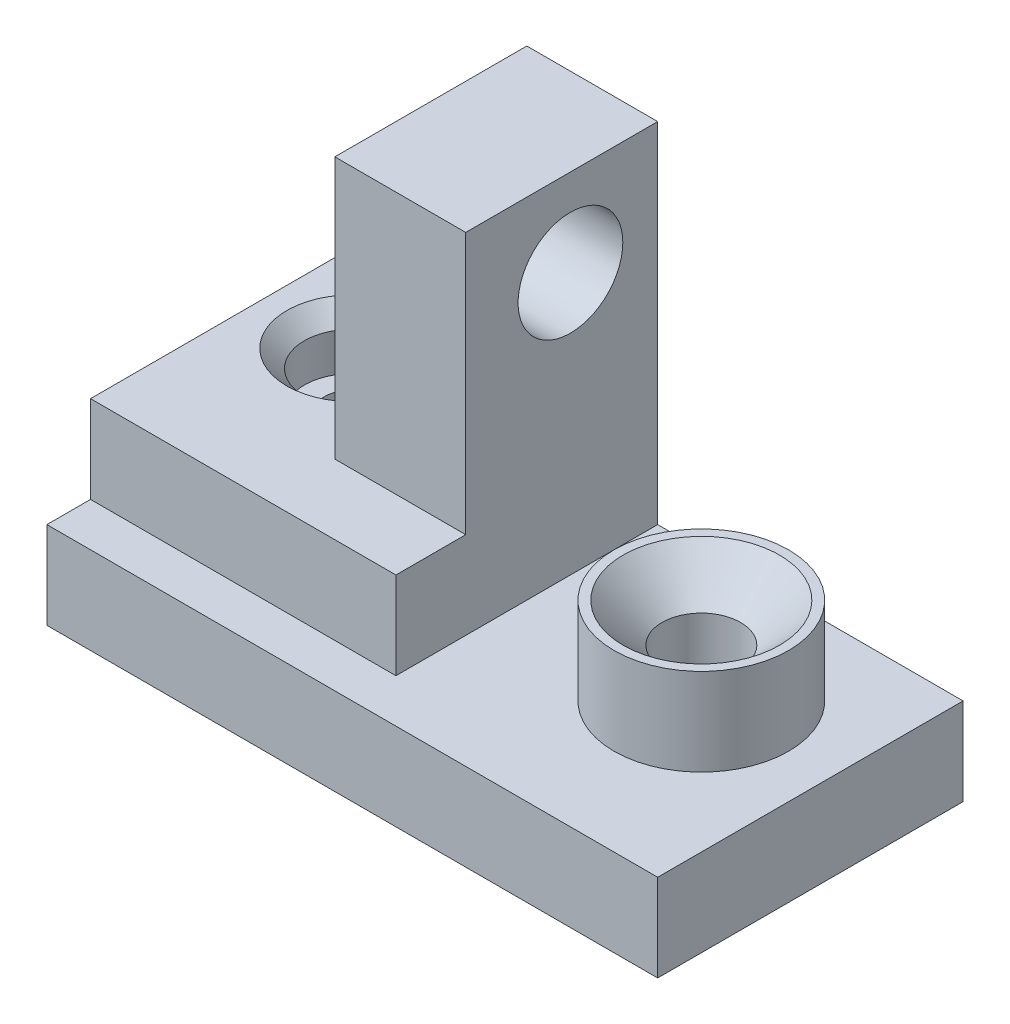
ISO-10303-21;
HEADER;
FILE_DESCRIPTION(('STEP AP214'),'2;1');
FILE_NAME('part.step','',(''),(''),'','','');
FILE_SCHEMA(('AUTOMOTIVE_DESIGN { 1 0 10303 214 1 1 1 1 }'));
ENDSEC;
DATA;
#1=APPLICATION_CONTEXT('core data for automotive mechanical design processes');
#2=APPLICATION_PROTOCOL_DEFINITION('international standard','automotive_design',2000,#1);
#3=PRODUCT_CONTEXT('',#1,'mechanical');
#4=PRODUCT('Part','Part','',(#3));
#5=PRODUCT_RELATED_PRODUCT_CATEGORY('part','',(#4));
#6=PRODUCT_DEFINITION_FORMATION('','',#4);
#7=PRODUCT_DEFINITION_CONTEXT('part definition',#1,'design');
#8=PRODUCT_DEFINITION('design','',#6,#7);
#9=PRODUCT_DEFINITION_SHAPE('','',#8);
#10=(LENGTH_UNIT() NAMED_UNIT(*) SI_UNIT(.MILLI.,.METRE.));
#11=(NAMED_UNIT(*) PLANE_ANGLE_UNIT() SI_UNIT($,.RADIAN.));
#12=(NAMED_UNIT(*) SI_UNIT($,.STERADIAN.) SOLID_ANGLE_UNIT());
#13=UNCERTAINTY_MEASURE_WITH_UNIT(LENGTH_MEASURE(1.E-05),#10,'distance_accuracy_value','');
#14=(GEOMETRIC_REPRESENTATION_CONTEXT(3) GLOBAL_UNCERTAINTY_ASSIGNED_CONTEXT((#13)) GLOBAL_UNIT_ASSIGNED_CONTEXT((#10,
#11,#12)) REPRESENTATION_CONTEXT('',''));
#15=CARTESIAN_POINT('',(0.,0.,0.));
#16=DIRECTION('',(0.,0.,1.));
#17=DIRECTION('',(1.,0.,0.));
#18=AXIS2_PLACEMENT_3D('',#15,#16,#17);
#19=CARTESIAN_POINT('',(0.,10.,-35.));
#20=DIRECTION('',(0.,0.,-1.));
#21=DIRECTION('',(-1.,0.,0.));
#22=AXIS2_PLACEMENT_3D('',#19,#20,#21);
#23=PLANE('',#22);
#24=DIRECTION('',(1.,0.,0.));
#25=VECTOR('',#24,1.);
#26=CARTESIAN_POINT('',(0.,0.,-35.));
#27=LINE('',#26,#25);
#28=CARTESIAN_POINT('',(0.,0.,-35.));
#29=VERTEX_POINT('',#28);
#30=CARTESIAN_POINT('',(70.,0.,-35.));
#31=VERTEX_POINT('',#30);
#32=EDGE_CURVE('E115',#29,#31,#27,.T.);
#33=ORIENTED_EDGE('',*,*,#32,.F.);
#34=DIRECTION('',(0.,-1.,0.));
#35=VECTOR('',#34,1.);
#36=CARTESIAN_POINT('',(0.,20.,-35.));
#37=LINE('',#36,#35);
#38=CARTESIAN_POINT('',(0.,20.,-35.));
#39=VERTEX_POINT('',#38);
#40=EDGE_CURVE('E117',#39,#29,#37,.T.);
#41=ORIENTED_EDGE('',*,*,#40,.F.);
#42=DIRECTION('',(1.,0.,0.));
#43=VECTOR('',#42,1.);
#44=CARTESIAN_POINT('',(0.,20.,-35.));
#45=LINE('',#44,#43);
#46=CARTESIAN_POINT('',(20.,20.,-35.));
#47=VERTEX_POINT('',#46);
#48=EDGE_CURVE('E162',#39,#47,#45,.T.);
#49=ORIENTED_EDGE('',*,*,#48,.T.);
#50=DIRECTION('',(0.,-1.,0.));
#51=VECTOR('',#50,1.);
#52=CARTESIAN_POINT('',(20.,50.,-35.));
#53=LINE('',#52,#51);
#54=CARTESIAN_POINT('',(20.,50.,-35.));
#55=VERTEX_POINT('',#54);
#56=EDGE_CURVE('E180',#55,#47,#53,.T.);
#57=ORIENTED_EDGE('',*,*,#56,.F.);
#58=DIRECTION('',(1.,0.,0.));
#59=VECTOR('',#58,1.);
#60=CARTESIAN_POINT('',(0.,50.,-35.));
#61=LINE('',#60,#59);
#62=CARTESIAN_POINT('',(35.,50.,-35.));
#63=VERTEX_POINT('',#62);
#64=EDGE_CURVE('E183',#55,#63,#61,.T.);
#65=ORIENTED_EDGE('',*,*,#64,.T.);
#66=DIRECTION('',(0.,-1.,0.));
#67=VECTOR('',#66,1.);
#68=CARTESIAN_POINT('',(35.,50.,-35.));
#69=LINE('',#68,#67);
#70=CARTESIAN_POINT('',(35.,10.,-35.));
#71=VERTEX_POINT('',#70);
#72=EDGE_CURVE('E178',#63,#71,#69,.T.);
#73=ORIENTED_EDGE('',*,*,#72,.T.);
#74=DIRECTION('',(1.,0.,0.));
#75=VECTOR('',#74,1.);
#76=CARTESIAN_POINT('',(0.,10.,-35.));
#77=LINE('',#76,#75);
#78=CARTESIAN_POINT('',(70.,10.,-35.));
#79=VERTEX_POINT('',#78);
#80=EDGE_CURVE('E78',#71,#79,#77,.T.);
#81=ORIENTED_EDGE('',*,*,#80,.T.);
#82=DIRECTION('',(0.,-1.,0.));
#83=VECTOR('',#82,1.);
#84=CARTESIAN_POINT('',(70.,10.,-35.));
#85=LINE('',#84,#83);
#86=EDGE_CURVE('E74',#79,#31,#85,.T.);
#87=ORIENTED_EDGE('',*,*,#86,.T.);
#88=EDGE_LOOP('',(#33,#41,#49,#57,#65,#73,#81,#87));
#89=FACE_BOUND('',#88,.T.);
#90=ADVANCED_FACE('F37',(#89),#23,.T.);
#91=CARTESIAN_POINT('',(0.,10.,0.));
#92=DIRECTION('',(-1.,0.,0.));
#93=DIRECTION('',(0.,0.,1.));
#94=AXIS2_PLACEMENT_3D('',#91,#92,#93);
#95=PLANE('',#94);
#96=DIRECTION('',(0.,0.,-1.));
#97=VECTOR('',#96,1.);
#98=CARTESIAN_POINT('',(0.,0.,0.));
#99=LINE('',#98,#97);
#100=CARTESIAN_POINT('',(0.,0.,0.));
#101=VERTEX_POINT('',#100);
#102=EDGE_CURVE('E99',#101,#29,#99,.T.);
#103=ORIENTED_EDGE('',*,*,#102,.F.);
#104=DIRECTION('',(0.,-1.,0.));
#105=VECTOR('',#104,1.);
#106=CARTESIAN_POINT('',(0.,10.,0.));
#107=LINE('',#106,#105);
#108=CARTESIAN_POINT('',(0.,10.,0.));
#109=VERTEX_POINT('',#108);
#110=EDGE_CURVE('E11',#109,#101,#107,.T.);
#111=ORIENTED_EDGE('',*,*,#110,.F.);
#112=DIRECTION('',(0.,0.,-1.));
#113=VECTOR('',#112,1.);
#114=CARTESIAN_POINT('',(0.,10.,0.));
#115=LINE('',#114,#113);
#116=CARTESIAN_POINT('',(0.,10.,-5.));
#117=VERTEX_POINT('',#116);
#118=EDGE_CURVE('E95',#109,#117,#115,.T.);
#119=ORIENTED_EDGE('',*,*,#118,.T.);
#120=DIRECTION('',(0.,-1.,0.));
#121=VECTOR('',#120,1.);
#122=CARTESIAN_POINT('',(0.,20.,-5.));
#123=LINE('',#122,#121);
#124=CARTESIAN_POINT('',(0.,20.,-5.));
#125=VERTEX_POINT('',#124);
#126=EDGE_CURVE('E135',#125,#117,#123,.T.);
#127=ORIENTED_EDGE('',*,*,#126,.F.);
#128=DIRECTION('',(0.,0.,-1.));
#129=VECTOR('',#128,1.);
#130=CARTESIAN_POINT('',(0.,20.,0.));
#131=LINE('',#130,#129);
#132=EDGE_CURVE('E132',#125,#39,#131,.T.);
#133=ORIENTED_EDGE('',*,*,#132,.T.);
#134=ORIENTED_EDGE('',*,*,#40,.T.);
#135=EDGE_LOOP('',(#103,#111,#119,#127,#133,#134));
#136=FACE_BOUND('',#135,.T.);
#137=ADVANCED_FACE('F92',(#136),#95,.T.);
#138=CARTESIAN_POINT('',(0.,10.,0.));
#139=DIRECTION('',(0.,0.,-1.));
#140=DIRECTION('',(-1.,0.,0.));
#141=AXIS2_PLACEMENT_3D('',#138,#139,#140);
#142=PLANE('',#141);
#143=DIRECTION('',(1.,0.,0.));
#144=VECTOR('',#143,1.);
#145=CARTESIAN_POINT('',(0.,0.,0.));
#146=LINE('',#145,#144);
#147=CARTESIAN_POINT('',(70.,0.,0.));
#148=VERTEX_POINT('',#147);
#149=EDGE_CURVE('E119',#101,#148,#146,.T.);
#150=ORIENTED_EDGE('',*,*,#149,.T.);
#151=DIRECTION('',(0.,-1.,0.));
#152=VECTOR('',#151,1.);
#153=CARTESIAN_POINT('',(70.,10.,0.));
#154=LINE('',#153,#152);
#155=CARTESIAN_POINT('',(70.,10.,0.));
#156=VERTEX_POINT('',#155);
#157=EDGE_CURVE('E45',#156,#148,#154,.T.);
#158=ORIENTED_EDGE('',*,*,#157,.F.);
#159=DIRECTION('',(1.,0.,0.));
#160=VECTOR('',#159,1.);
#161=CARTESIAN_POINT('',(0.,10.,0.));
#162=LINE('',#161,#160);
#163=EDGE_CURVE('E103',#109,#156,#162,.T.);
#164=ORIENTED_EDGE('',*,*,#163,.F.);
#165=ORIENTED_EDGE('',*,*,#110,.T.);
#166=EDGE_LOOP('',(#150,#158,#164,#165));
#167=FACE_BOUND('',#166,.T.);
#168=ADVANCED_FACE('F104',(#167),#142,.F.);
#169=CARTESIAN_POINT('',(70.,10.,0.));
#170=DIRECTION('',(-1.,0.,0.));
#171=DIRECTION('',(0.,0.,1.));
#172=AXIS2_PLACEMENT_3D('',#169,#170,#171);
#173=PLANE('',#172);
#174=DIRECTION('',(0.,0.,-1.));
#175=VECTOR('',#174,1.);
#176=CARTESIAN_POINT('',(70.,0.,0.));
#177=LINE('',#176,#175);
#178=EDGE_CURVE('E67',#148,#31,#177,.T.);
#179=ORIENTED_EDGE('',*,*,#178,.T.);
#180=ORIENTED_EDGE('',*,*,#86,.F.);
#181=DIRECTION('',(0.,0.,-1.));
#182=VECTOR('',#181,1.);
#183=CARTESIAN_POINT('',(70.,10.,0.));
#184=LINE('',#183,#182);
#185=EDGE_CURVE('E53',#156,#79,#184,.T.);
#186=ORIENTED_EDGE('',*,*,#185,.F.);
#187=ORIENTED_EDGE('',*,*,#157,.T.);
#188=EDGE_LOOP('',(#179,#180,#186,#187));
#189=FACE_BOUND('',#188,.T.);
#190=ADVANCED_FACE('F124',(#189),#173,.F.);
#191=CARTESIAN_POINT('',(0.,10.,0.));
#192=DIRECTION('',(0.,1.,0.));
#193=DIRECTION('',(0.,0.,1.));
#194=AXIS2_PLACEMENT_3D('',#191,#192,#193);
#195=PLANE('',#194);
#196=CARTESIAN_POINT('',(55.,10.,-20.));
#197=DIRECTION('',(0.,1.,0.));
#198=DIRECTION('',(0.,0.,1.));
#199=AXIS2_PLACEMENT_3D('',#196,#197,#198);
#200=CIRCLE('',#199,9.99999999999999);
#201=CARTESIAN_POINT('',(55.,10.,-10.));
#202=VERTEX_POINT('',#201);
#203=EDGE_CURVE('E122',#202,#202,#200,.T.);
#204=ORIENTED_EDGE('',*,*,#203,.F.);
#205=EDGE_LOOP('',(#204));
#206=FACE_BOUND('',#205,.T.);
#207=ORIENTED_EDGE('',*,*,#80,.F.);
#208=DIRECTION('',(0.,0.,1.));
#209=VECTOR('',#208,1.);
#210=CARTESIAN_POINT('',(35.,10.,0.));
#211=LINE('',#210,#209);
#212=CARTESIAN_POINT('',(35.,10.,-5.));
#213=VERTEX_POINT('',#212);
#214=EDGE_CURVE('E110',#71,#213,#211,.T.);
#215=ORIENTED_EDGE('',*,*,#214,.T.);
#216=DIRECTION('',(1.,0.,0.));
#217=VECTOR('',#216,1.);
#218=CARTESIAN_POINT('',(0.,10.,-5.));
#219=LINE('',#218,#217);
#220=EDGE_CURVE('E108',#117,#213,#219,.T.);
#221=ORIENTED_EDGE('',*,*,#220,.F.);
#222=ORIENTED_EDGE('',*,*,#118,.F.);
#223=ORIENTED_EDGE('',*,*,#163,.T.);
#224=ORIENTED_EDGE('',*,*,#185,.T.);
#225=EDGE_LOOP('',(#207,#215,#221,#222,#223,#224));
#226=FACE_BOUND('',#225,.T.);
#227=ADVANCED_FACE('F106',(#206,#226),#195,.T.);
#228=CARTESIAN_POINT('',(0.,0.,0.));
#229=DIRECTION('',(0.,1.,0.));
#230=DIRECTION('',(0.,0.,1.));
#231=AXIS2_PLACEMENT_3D('',#228,#229,#230);
#232=PLANE('',#231);
#233=CARTESIAN_POINT('',(55.,0.,-20.));
#234=DIRECTION('',(0.,1.,0.));
#235=DIRECTION('',(0.,0.,1.));
#236=AXIS2_PLACEMENT_3D('',#233,#234,#235);
#237=CIRCLE('',#236,4.5);
#238=CARTESIAN_POINT('',(55.,0.,-15.5));
#239=VERTEX_POINT('',#238);
#240=EDGE_CURVE('E195',#239,#239,#237,.T.);
#241=ORIENTED_EDGE('',*,*,#240,.T.);
#242=EDGE_LOOP('',(#241));
#243=FACE_BOUND('',#242,.T.);
#244=ORIENTED_EDGE('',*,*,#102,.T.);
#245=ORIENTED_EDGE('',*,*,#32,.T.);
#246=ORIENTED_EDGE('',*,*,#178,.F.);
#247=ORIENTED_EDGE('',*,*,#149,.F.);
#248=EDGE_LOOP('',(#244,#245,#246,#247));
#249=FACE_BOUND('',#248,.T.);
#250=ADVANCED_FACE('F125',(#243,#249),#232,.F.);
#251=CARTESIAN_POINT('',(0.,20.,-5.));
#252=DIRECTION('',(0.,0.,-1.));
#253=DIRECTION('',(-1.,0.,0.));
#254=AXIS2_PLACEMENT_3D('',#251,#252,#253);
#255=PLANE('',#254);
#256=ORIENTED_EDGE('',*,*,#220,.T.);
#257=DIRECTION('',(0.,-1.,0.));
#258=VECTOR('',#257,1.);
#259=CARTESIAN_POINT('',(35.,20.,-5.));
#260=LINE('',#259,#258);
#261=CARTESIAN_POINT('',(35.,20.,-5.));
#262=VERTEX_POINT('',#261);
#263=EDGE_CURVE('E137',#262,#213,#260,.T.);
#264=ORIENTED_EDGE('',*,*,#263,.F.);
#265=DIRECTION('',(1.,0.,0.));
#266=VECTOR('',#265,1.);
#267=CARTESIAN_POINT('',(0.,20.,-5.));
#268=LINE('',#267,#266);
#269=EDGE_CURVE('E156',#125,#262,#268,.T.);
#270=ORIENTED_EDGE('',*,*,#269,.F.);
#271=ORIENTED_EDGE('',*,*,#126,.T.);
#272=EDGE_LOOP('',(#256,#264,#270,#271));
#273=FACE_BOUND('',#272,.T.);
#274=ADVANCED_FACE('F149',(#273),#255,.F.);
#275=CARTESIAN_POINT('',(35.,20.,0.));
#276=DIRECTION('',(1.,0.,0.));
#277=DIRECTION('',(0.,0.,-1.));
#278=AXIS2_PLACEMENT_3D('',#275,#276,#277);
#279=PLANE('',#278);
#280=CARTESIAN_POINT('',(35.,40.,-25.));
#281=DIRECTION('',(1.,0.,0.));
#282=DIRECTION('',(0.,0.,-1.));
#283=AXIS2_PLACEMENT_3D('',#280,#281,#282);
#284=CIRCLE('',#283,6.);
#285=CARTESIAN_POINT('',(35.,40.,-31.));
#286=VERTEX_POINT('',#285);
#287=EDGE_CURVE('E222',#286,#286,#284,.T.);
#288=ORIENTED_EDGE('',*,*,#287,.F.);
#289=EDGE_LOOP('',(#288));
#290=FACE_BOUND('',#289,.T.);
#291=ORIENTED_EDGE('',*,*,#263,.T.);
#292=ORIENTED_EDGE('',*,*,#214,.F.);
#293=ORIENTED_EDGE('',*,*,#72,.F.);
#294=DIRECTION('',(0.,0.,1.));
#295=VECTOR('',#294,1.);
#296=CARTESIAN_POINT('',(35.,50.,0.));
#297=LINE('',#296,#295);
#298=CARTESIAN_POINT('',(35.,50.,-13.));
#299=VERTEX_POINT('',#298);
#300=EDGE_CURVE('E186',#63,#299,#297,.T.);
#301=ORIENTED_EDGE('',*,*,#300,.T.);
#302=DIRECTION('',(0.,-1.,0.));
#303=VECTOR('',#302,1.);
#304=CARTESIAN_POINT('',(35.,50.,-13.));
#305=LINE('',#304,#303);
#306=CARTESIAN_POINT('',(35.,20.,-13.));
#307=VERTEX_POINT('',#306);
#308=EDGE_CURVE('E176',#299,#307,#305,.T.);
#309=ORIENTED_EDGE('',*,*,#308,.T.);
#310=DIRECTION('',(0.,0.,1.));
#311=VECTOR('',#310,1.);
#312=CARTESIAN_POINT('',(35.,20.,0.));
#313=LINE('',#312,#311);
#314=EDGE_CURVE('E155',#307,#262,#313,.T.);
#315=ORIENTED_EDGE('',*,*,#314,.T.);
#316=EDGE_LOOP('',(#291,#292,#293,#301,#309,#315));
#317=FACE_BOUND('',#316,.T.);
#318=ADVANCED_FACE('F152',(#290,#317),#279,.T.);
#319=CARTESIAN_POINT('',(0.,20.,0.));
#320=DIRECTION('',(0.,1.,0.));
#321=DIRECTION('',(0.,0.,1.));
#322=AXIS2_PLACEMENT_3D('',#319,#320,#321);
#323=PLANE('',#322);
#324=CARTESIAN_POINT('',(10.,20.,-25.));
#325=DIRECTION('',(0.,1.,0.));
#326=DIRECTION('',(0.,0.,1.));
#327=AXIS2_PLACEMENT_3D('',#324,#325,#326);
#328=CIRCLE('',#327,7.5);
#329=CARTESIAN_POINT('',(10.,20.,-17.5));
#330=VERTEX_POINT('',#329);
#331=EDGE_CURVE('E216',#330,#330,#328,.T.);
#332=ORIENTED_EDGE('',*,*,#331,.F.);
#333=EDGE_LOOP('',(#332));
#334=FACE_BOUND('',#333,.T.);
#335=DIRECTION('',(1.,0.,0.));
#336=VECTOR('',#335,1.);
#337=CARTESIAN_POINT('',(0.,20.,-13.));
#338=LINE('',#337,#336);
#339=CARTESIAN_POINT('',(20.,20.,-13.));
#340=VERTEX_POINT('',#339);
#341=EDGE_CURVE('E167',#340,#307,#338,.T.);
#342=ORIENTED_EDGE('',*,*,#341,.F.);
#343=DIRECTION('',(0.,0.,1.));
#344=VECTOR('',#343,1.);
#345=CARTESIAN_POINT('',(20.,20.,0.));
#346=LINE('',#345,#344);
#347=EDGE_CURVE('E164',#47,#340,#346,.T.);
#348=ORIENTED_EDGE('',*,*,#347,.F.);
#349=ORIENTED_EDGE('',*,*,#48,.F.);
#350=ORIENTED_EDGE('',*,*,#132,.F.);
#351=ORIENTED_EDGE('',*,*,#269,.T.);
#352=ORIENTED_EDGE('',*,*,#314,.F.);
#353=EDGE_LOOP('',(#342,#348,#349,#350,#351,#352));
#354=FACE_BOUND('',#353,.T.);
#355=ADVANCED_FACE('F229',(#334,#354),#323,.T.);
#356=CARTESIAN_POINT('',(55.,20.,-20.));
#357=DIRECTION('',(0.,-1.,0.));
#358=DIRECTION('',(0.,0.,-1.));
#359=AXIS2_PLACEMENT_3D('',#356,#357,#358);
#360=CYLINDRICAL_SURFACE('',#359,9.99999999999999);
#361=ORIENTED_EDGE('',*,*,#203,.T.);
#362=EDGE_LOOP('',(#361));
#363=FACE_BOUND('',#362,.T.);
#364=CARTESIAN_POINT('',(55.,20.,-20.));
#365=DIRECTION('',(0.,1.,0.));
#366=DIRECTION('',(0.,0.,1.));
#367=AXIS2_PLACEMENT_3D('',#364,#365,#366);
#368=CIRCLE('',#367,9.99999999999999);
#369=CARTESIAN_POINT('',(55.,20.,-10.));
#370=VERTEX_POINT('',#369);
#371=EDGE_CURVE('E170',#370,#370,#368,.T.);
#372=ORIENTED_EDGE('',*,*,#371,.F.);
#373=EDGE_LOOP('',(#372));
#374=FACE_BOUND('',#373,.T.);
#375=ADVANCED_FACE('F235',(#363,#374),#360,.T.);
#376=CARTESIAN_POINT('',(0.,20.,0.));
#377=DIRECTION('',(0.,1.,0.));
#378=DIRECTION('',(0.,0.,1.));
#379=AXIS2_PLACEMENT_3D('',#376,#377,#378);
#380=PLANE('',#379);
#381=CARTESIAN_POINT('',(55.,20.,-20.));
#382=DIRECTION('',(0.,1.,0.));
#383=DIRECTION('',(0.,0.,1.));
#384=AXIS2_PLACEMENT_3D('',#381,#382,#383);
#385=CIRCLE('',#384,8.96);
#386=CARTESIAN_POINT('',(55.,20.,-11.04));
#387=VERTEX_POINT('',#386);
#388=EDGE_CURVE('E201',#387,#387,#385,.T.);
#389=ORIENTED_EDGE('',*,*,#388,.F.);
#390=EDGE_LOOP('',(#389));
#391=FACE_BOUND('',#390,.T.);
#392=ORIENTED_EDGE('',*,*,#371,.T.);
#393=EDGE_LOOP('',(#392));
#394=FACE_BOUND('',#393,.T.);
#395=ADVANCED_FACE('F261',(#391,#394),#380,.T.);
#396=CARTESIAN_POINT('',(20.,50.,0.));
#397=DIRECTION('',(1.,0.,0.));
#398=DIRECTION('',(0.,0.,-1.));
#399=AXIS2_PLACEMENT_3D('',#396,#397,#398);
#400=PLANE('',#399);
#401=ORIENTED_EDGE('',*,*,#347,.T.);
#402=DIRECTION('',(0.,-1.,0.));
#403=VECTOR('',#402,1.);
#404=CARTESIAN_POINT('',(20.,50.,-13.));
#405=LINE('',#404,#403);
#406=CARTESIAN_POINT('',(20.,50.,-13.));
#407=VERTEX_POINT('',#406);
#408=EDGE_CURVE('E173',#407,#340,#405,.T.);
#409=ORIENTED_EDGE('',*,*,#408,.F.);
#410=DIRECTION('',(0.,0.,1.));
#411=VECTOR('',#410,1.);
#412=CARTESIAN_POINT('',(20.,50.,0.));
#413=LINE('',#412,#411);
#414=EDGE_CURVE('E192',#55,#407,#413,.T.);
#415=ORIENTED_EDGE('',*,*,#414,.F.);
#416=ORIENTED_EDGE('',*,*,#56,.T.);
#417=EDGE_LOOP('',(#401,#409,#415,#416));
#418=FACE_BOUND('',#417,.T.);
#419=ADVANCED_FACE('F266',(#418),#400,.F.);
#420=CARTESIAN_POINT('',(0.,50.,-13.));
#421=DIRECTION('',(0.,0.,-1.));
#422=DIRECTION('',(-1.,0.,0.));
#423=AXIS2_PLACEMENT_3D('',#420,#421,#422);
#424=PLANE('',#423);
#425=ORIENTED_EDGE('',*,*,#341,.T.);
#426=ORIENTED_EDGE('',*,*,#308,.F.);
#427=DIRECTION('',(1.,0.,0.));
#428=VECTOR('',#427,1.);
#429=CARTESIAN_POINT('',(0.,50.,-13.));
#430=LINE('',#429,#428);
#431=EDGE_CURVE('E189',#407,#299,#430,.T.);
#432=ORIENTED_EDGE('',*,*,#431,.F.);
#433=ORIENTED_EDGE('',*,*,#408,.T.);
#434=EDGE_LOOP('',(#425,#426,#432,#433));
#435=FACE_BOUND('',#434,.T.);
#436=ADVANCED_FACE('F272',(#435),#424,.F.);
#437=CARTESIAN_POINT('',(0.,50.,0.));
#438=DIRECTION('',(0.,1.,0.));
#439=DIRECTION('',(0.,0.,1.));
#440=AXIS2_PLACEMENT_3D('',#437,#438,#439);
#441=PLANE('',#440);
#442=ORIENTED_EDGE('',*,*,#414,.T.);
#443=ORIENTED_EDGE('',*,*,#431,.T.);
#444=ORIENTED_EDGE('',*,*,#300,.F.);
#445=ORIENTED_EDGE('',*,*,#64,.F.);
#446=EDGE_LOOP('',(#442,#443,#444,#445));
#447=FACE_BOUND('',#446,.T.);
#448=ADVANCED_FACE('F279',(#447),#441,.T.);
#449=CARTESIAN_POINT('',(55.,20.,-20.));
#450=DIRECTION('',(0.,1.,0.));
#451=DIRECTION('',(0.,0.,1.));
#452=AXIS2_PLACEMENT_3D('',#449,#450,#451);
#453=CYLINDRICAL_SURFACE('',#452,4.5);
#454=ORIENTED_EDGE('',*,*,#240,.F.);
#455=EDGE_LOOP('',(#454));
#456=FACE_BOUND('',#455,.T.);
#457=CARTESIAN_POINT('',(55.,15.54,-20.));
#458=DIRECTION('',(0.,1.,0.));
#459=DIRECTION('',(0.,0.,1.));
#460=AXIS2_PLACEMENT_3D('',#457,#458,#459);
#461=CIRCLE('',#460,4.5);
#462=CARTESIAN_POINT('',(55.,15.54,-15.5));
#463=VERTEX_POINT('',#462);
#464=EDGE_CURVE('E198',#463,#463,#461,.T.);
#465=ORIENTED_EDGE('',*,*,#464,.T.);
#466=EDGE_LOOP('',(#465));
#467=FACE_BOUND('',#466,.T.);
#468=ADVANCED_FACE('F283',(#456,#467),#453,.F.);
#469=CARTESIAN_POINT('',(55.,20.,-20.));
#470=DIRECTION('',(0.,1.,0.));
#471=DIRECTION('',(0.,0.,1.));
#472=AXIS2_PLACEMENT_3D('',#469,#470,#471);
#473=CONICAL_SURFACE('',#472,8.96,0.785398163397447);
#474=ORIENTED_EDGE('',*,*,#464,.F.);
#475=EDGE_LOOP('',(#474));
#476=FACE_BOUND('',#475,.T.);
#477=ORIENTED_EDGE('',*,*,#388,.T.);
#478=EDGE_LOOP('',(#477));
#479=FACE_BOUND('',#478,.T.);
#480=ADVANCED_FACE('F287',(#476,#479),#473,.F.);
#481=CARTESIAN_POINT('',(10.,10.,-25.));
#482=DIRECTION('',(0.,1.,0.));
#483=DIRECTION('',(0.,0.,1.));
#484=AXIS2_PLACEMENT_3D('',#481,#482,#483);
#485=CONICAL_SURFACE('',#484,3.2,1.02974425867665);
#486=CARTESIAN_POINT('',(10.,8.07724601911181,-25.));
#487=VERTEX_POINT('',#486);
#488=VERTEX_LOOP('',#487);
#489=FACE_BOUND('',#488,.T.);
#490=CARTESIAN_POINT('',(10.,10.,-25.));
#491=DIRECTION('',(0.,1.,0.));
#492=DIRECTION('',(0.,0.,1.));
#493=AXIS2_PLACEMENT_3D('',#490,#491,#492);
#494=CIRCLE('',#493,3.2);
#495=CARTESIAN_POINT('',(10.,10.,-21.8));
#496=VERTEX_POINT('',#495);
#497=EDGE_CURVE('E204',#496,#496,#494,.T.);
#498=ORIENTED_EDGE('',*,*,#497,.T.);
#499=EDGE_LOOP('',(#498));
#500=FACE_BOUND('',#499,.T.);
#501=ADVANCED_FACE('F291',(#489,#500),#485,.F.);
#502=CARTESIAN_POINT('',(10.,20.,-25.));
#503=DIRECTION('',(0.,1.,0.));
#504=DIRECTION('',(0.,0.,1.));
#505=AXIS2_PLACEMENT_3D('',#502,#503,#504);
#506=CYLINDRICAL_SURFACE('',#505,3.2);
#507=ORIENTED_EDGE('',*,*,#497,.F.);
#508=EDGE_LOOP('',(#507));
#509=FACE_BOUND('',#508,.T.);
#510=CARTESIAN_POINT('',(10.,13.6,-25.));
#511=DIRECTION('',(0.,1.,0.));
#512=DIRECTION('',(0.,0.,1.));
#513=AXIS2_PLACEMENT_3D('',#510,#511,#512);
#514=CIRCLE('',#513,3.2);
#515=CARTESIAN_POINT('',(10.,13.6,-21.8));
#516=VERTEX_POINT('',#515);
#517=EDGE_CURVE('E207',#516,#516,#514,.T.);
#518=ORIENTED_EDGE('',*,*,#517,.T.);
#519=EDGE_LOOP('',(#518));
#520=FACE_BOUND('',#519,.T.);
#521=ADVANCED_FACE('F295',(#509,#520),#506,.F.);
#522=CARTESIAN_POINT('',(13.2,13.6,-25.));
#523=DIRECTION('',(0.,-1.,0.));
#524=DIRECTION('',(0.,0.,-1.));
#525=AXIS2_PLACEMENT_3D('',#522,#523,#524);
#526=PLANE('',#525);
#527=ORIENTED_EDGE('',*,*,#517,.F.);
#528=EDGE_LOOP('',(#527));
#529=FACE_BOUND('',#528,.T.);
#530=CARTESIAN_POINT('',(10.,13.6,-25.));
#531=DIRECTION('',(0.,1.,0.));
#532=DIRECTION('',(0.,0.,1.));
#533=AXIS2_PLACEMENT_3D('',#530,#531,#532);
#534=CIRCLE('',#533,5.5);
#535=CARTESIAN_POINT('',(10.,13.6,-19.5));
#536=VERTEX_POINT('',#535);
#537=EDGE_CURVE('E210',#536,#536,#534,.T.);
#538=ORIENTED_EDGE('',*,*,#537,.T.);
#539=EDGE_LOOP('',(#538));
#540=FACE_BOUND('',#539,.T.);
#541=ADVANCED_FACE('F299',(#529,#540),#526,.F.);
#542=CARTESIAN_POINT('',(10.,20.,-25.));
#543=DIRECTION('',(0.,1.,0.));
#544=DIRECTION('',(0.,0.,1.));
#545=AXIS2_PLACEMENT_3D('',#542,#543,#544);
#546=CYLINDRICAL_SURFACE('',#545,5.5);
#547=ORIENTED_EDGE('',*,*,#537,.F.);
#548=EDGE_LOOP('',(#547));
#549=FACE_BOUND('',#548,.T.);
#550=CARTESIAN_POINT('',(10.,18.,-25.));
#551=DIRECTION('',(0.,1.,0.));
#552=DIRECTION('',(0.,0.,1.));
#553=AXIS2_PLACEMENT_3D('',#550,#551,#552);
#554=CIRCLE('',#553,5.5);
#555=CARTESIAN_POINT('',(10.,18.,-19.5));
#556=VERTEX_POINT('',#555);
#557=EDGE_CURVE('E213',#556,#556,#554,.T.);
#558=ORIENTED_EDGE('',*,*,#557,.T.);
#559=EDGE_LOOP('',(#558));
#560=FACE_BOUND('',#559,.T.);
#561=ADVANCED_FACE('F303',(#549,#560),#546,.F.);
#562=CARTESIAN_POINT('',(10.,20.,-25.));
#563=DIRECTION('',(0.,1.,0.));
#564=DIRECTION('',(0.,0.,1.));
#565=AXIS2_PLACEMENT_3D('',#562,#563,#564);
#566=CONICAL_SURFACE('',#565,7.5,0.785398163397448);
#567=ORIENTED_EDGE('',*,*,#557,.F.);
#568=EDGE_LOOP('',(#567));
#569=FACE_BOUND('',#568,.T.);
#570=ORIENTED_EDGE('',*,*,#331,.T.);
#571=EDGE_LOOP('',(#570));
#572=FACE_BOUND('',#571,.T.);
#573=ADVANCED_FACE('F307',(#569,#572),#566,.F.);
#574=CARTESIAN_POINT('',(25.,40.,-25.));
#575=DIRECTION('',(1.,0.,0.));
#576=DIRECTION('',(0.,0.,-1.));
#577=AXIS2_PLACEMENT_3D('',#574,#575,#576);
#578=CONICAL_SURFACE('',#577,6.,1.0471975511966);
#579=CARTESIAN_POINT('',(21.5358983848623,40.,-25.));
#580=VERTEX_POINT('',#579);
#581=VERTEX_LOOP('',#580);
#582=FACE_BOUND('',#581,.T.);
#583=CARTESIAN_POINT('',(25.,40.,-25.));
#584=DIRECTION('',(1.,0.,0.));
#585=DIRECTION('',(0.,0.,-1.));
#586=AXIS2_PLACEMENT_3D('',#583,#584,#585);
#587=CIRCLE('',#586,6.);
#588=CARTESIAN_POINT('',(25.,40.,-31.));
#589=VERTEX_POINT('',#588);
#590=EDGE_CURVE('E219',#589,#589,#587,.T.);
#591=ORIENTED_EDGE('',*,*,#590,.T.);
#592=EDGE_LOOP('',(#591));
#593=FACE_BOUND('',#592,.T.);
#594=ADVANCED_FACE('F311',(#582,#593),#578,.F.);
#595=CARTESIAN_POINT('',(35.,40.,-25.));
#596=DIRECTION('',(1.,0.,0.));
#597=DIRECTION('',(0.,0.,-1.));
#598=AXIS2_PLACEMENT_3D('',#595,#596,#597);
#599=CYLINDRICAL_SURFACE('',#598,6.);
#600=ORIENTED_EDGE('',*,*,#590,.F.);
#601=EDGE_LOOP('',(#600));
#602=FACE_BOUND('',#601,.T.);
#603=ORIENTED_EDGE('',*,*,#287,.T.);
#604=EDGE_LOOP('',(#603));
#605=FACE_BOUND('',#604,.T.);
#606=ADVANCED_FACE('F226',(#602,#605),#599,.F.);
#607=CLOSED_SHELL('',(#90,#137,#168,#190,#227,#250,#274,#318,#355,#375,#395,#419,#436,#448,#468,
#480,#501,#521,#541,#561,#573,#594,#606));
#608=MANIFOLD_SOLID_BREP('B2',#607);
#609=ADVANCED_BREP_SHAPE_REPRESENTATION('',(#18,#608),#14);
#610=SHAPE_DEFINITION_REPRESENTATION(#9,#609);
ENDSEC;
END-ISO-10303-21;
